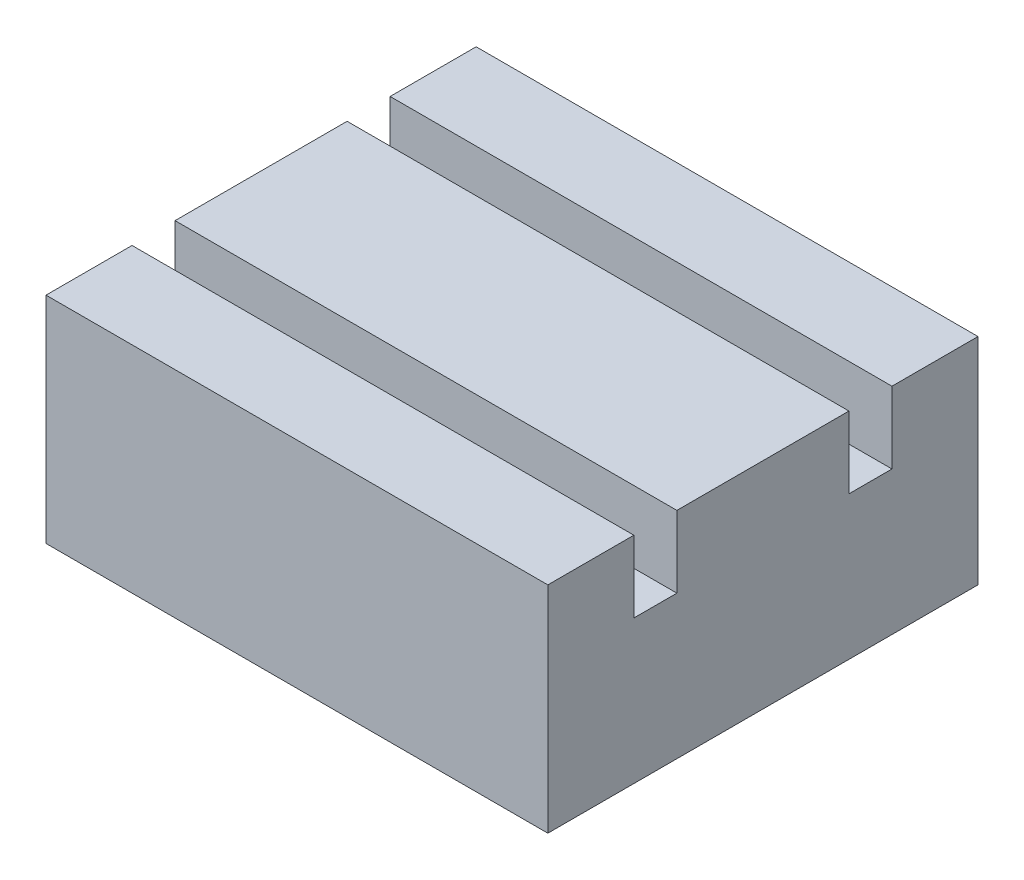
ISO-10303-21;
HEADER;
FILE_DESCRIPTION(('STEP AP214'),'2;1');
FILE_NAME('part.step','',(''),(''),'','','');
FILE_SCHEMA(('AUTOMOTIVE_DESIGN { 1 0 10303 214 1 1 1 1 }'));
ENDSEC;
DATA;
#1=APPLICATION_CONTEXT('core data for automotive mechanical design processes');
#2=APPLICATION_PROTOCOL_DEFINITION('international standard','automotive_design',2000,#1);
#3=PRODUCT_CONTEXT('',#1,'mechanical');
#4=PRODUCT('Part','Part','',(#3));
#5=PRODUCT_RELATED_PRODUCT_CATEGORY('part','',(#4));
#6=PRODUCT_DEFINITION_FORMATION('','',#4);
#7=PRODUCT_DEFINITION_CONTEXT('part definition',#1,'design');
#8=PRODUCT_DEFINITION('design','',#6,#7);
#9=PRODUCT_DEFINITION_SHAPE('','',#8);
#10=(LENGTH_UNIT() NAMED_UNIT(*) SI_UNIT(.MILLI.,.METRE.));
#11=(NAMED_UNIT(*) PLANE_ANGLE_UNIT() SI_UNIT($,.RADIAN.));
#12=(NAMED_UNIT(*) SI_UNIT($,.STERADIAN.) SOLID_ANGLE_UNIT());
#13=UNCERTAINTY_MEASURE_WITH_UNIT(LENGTH_MEASURE(1.E-05),#10,'distance_accuracy_value','');
#14=(GEOMETRIC_REPRESENTATION_CONTEXT(3) GLOBAL_UNCERTAINTY_ASSIGNED_CONTEXT((#13)) GLOBAL_UNIT_ASSIGNED_CONTEXT((#10,
#11,#12)) REPRESENTATION_CONTEXT('',''));
#15=CARTESIAN_POINT('',(0.,0.,0.));
#16=DIRECTION('',(0.,0.,1.));
#17=DIRECTION('',(1.,0.,0.));
#18=AXIS2_PLACEMENT_3D('',#15,#16,#17);
#19=CARTESIAN_POINT('',(0.,0.,0.));
#20=DIRECTION('',(0.,1.,0.));
#21=DIRECTION('',(0.,0.,1.));
#22=AXIS2_PLACEMENT_3D('',#19,#20,#21);
#23=PLANE('',#22);
#24=DIRECTION('',(0.,0.,-1.));
#25=VECTOR('',#24,1.);
#26=CARTESIAN_POINT('',(35.,0.,30.));
#27=LINE('',#26,#25);
#28=CARTESIAN_POINT('',(35.,0.,12.));
#29=VERTEX_POINT('',#28);
#30=CARTESIAN_POINT('',(35.,0.,-12.));
#31=VERTEX_POINT('',#30);
#32=EDGE_CURVE('E227',#29,#31,#27,.T.);
#33=ORIENTED_EDGE('',*,*,#32,.T.);
#34=DIRECTION('',(-1.,0.,0.));
#35=VECTOR('',#34,1.);
#36=CARTESIAN_POINT('',(0.,0.,-12.));
#37=LINE('',#36,#35);
#38=CARTESIAN_POINT('',(-35.,0.,-12.));
#39=VERTEX_POINT('',#38);
#40=EDGE_CURVE('E166',#31,#39,#37,.T.);
#41=ORIENTED_EDGE('',*,*,#40,.T.);
#42=DIRECTION('',(0.,0.,1.));
#43=VECTOR('',#42,1.);
#44=CARTESIAN_POINT('',(-35.,0.,30.));
#45=LINE('',#44,#43);
#46=CARTESIAN_POINT('',(-35.,0.,12.));
#47=VERTEX_POINT('',#46);
#48=EDGE_CURVE('E149',#39,#47,#45,.T.);
#49=ORIENTED_EDGE('',*,*,#48,.T.);
#50=DIRECTION('',(-1.,0.,0.));
#51=VECTOR('',#50,1.);
#52=CARTESIAN_POINT('',(0.,0.,12.));
#53=LINE('',#52,#51);
#54=EDGE_CURVE('E48',#29,#47,#53,.T.);
#55=ORIENTED_EDGE('',*,*,#54,.F.);
#56=EDGE_LOOP('',(#33,#41,#49,#55));
#57=FACE_BOUND('',#56,.T.);
#58=ADVANCED_FACE('F39',(#57),#23,.T.);
#59=CARTESIAN_POINT('',(-35.,0.,-30.));
#60=VERTEX_POINT('',#59);
#61=CARTESIAN_POINT('',(-35.,0.,-18.));
#62=VERTEX_POINT('',#61);
#63=EDGE_CURVE('E214',#60,#62,#45,.T.);
#64=ORIENTED_EDGE('',*,*,#63,.T.);
#65=DIRECTION('',(1.,0.,0.));
#66=VECTOR('',#65,1.);
#67=CARTESIAN_POINT('',(0.,0.,-18.));
#68=LINE('',#67,#66);
#69=CARTESIAN_POINT('',(35.,0.,-18.));
#70=VERTEX_POINT('',#69);
#71=EDGE_CURVE('E161',#62,#70,#68,.T.);
#72=ORIENTED_EDGE('',*,*,#71,.T.);
#73=CARTESIAN_POINT('',(35.,0.,-30.));
#74=VERTEX_POINT('',#73);
#75=EDGE_CURVE('E222',#70,#74,#27,.T.);
#76=ORIENTED_EDGE('',*,*,#75,.T.);
#77=DIRECTION('',(-1.,0.,0.));
#78=VECTOR('',#77,1.);
#79=CARTESIAN_POINT('',(35.,0.,-30.));
#80=LINE('',#79,#78);
#81=EDGE_CURVE('E201',#74,#60,#80,.T.);
#82=ORIENTED_EDGE('',*,*,#81,.T.);
#83=EDGE_LOOP('',(#64,#72,#76,#82));
#84=FACE_BOUND('',#83,.T.);
#85=ADVANCED_FACE('F268',(#84),#23,.T.);
#86=CARTESIAN_POINT('',(-35.,-30.,30.));
#87=DIRECTION('',(-1.,0.,0.));
#88=DIRECTION('',(0.,0.,1.));
#89=AXIS2_PLACEMENT_3D('',#86,#87,#88);
#90=PLANE('',#89);
#91=ORIENTED_EDGE('',*,*,#48,.F.);
#92=DIRECTION('',(0.,1.,0.));
#93=VECTOR('',#92,1.);
#94=CARTESIAN_POINT('',(-35.,10.,-12.));
#95=LINE('',#94,#93);
#96=CARTESIAN_POINT('',(-35.,-10.,-12.));
#97=VERTEX_POINT('',#96);
#98=EDGE_CURVE('E141',#97,#39,#95,.T.);
#99=ORIENTED_EDGE('',*,*,#98,.F.);
#100=DIRECTION('',(0.,0.,1.));
#101=VECTOR('',#100,1.);
#102=CARTESIAN_POINT('',(-35.,-10.,-18.));
#103=LINE('',#102,#101);
#104=CARTESIAN_POINT('',(-35.,-10.,-18.));
#105=VERTEX_POINT('',#104);
#106=EDGE_CURVE('E130',#105,#97,#103,.T.);
#107=ORIENTED_EDGE('',*,*,#106,.F.);
#108=DIRECTION('',(0.,-1.,0.));
#109=VECTOR('',#108,1.);
#110=CARTESIAN_POINT('',(-35.,10.,-18.));
#111=LINE('',#110,#109);
#112=EDGE_CURVE('E140',#62,#105,#111,.T.);
#113=ORIENTED_EDGE('',*,*,#112,.F.);
#114=ORIENTED_EDGE('',*,*,#63,.F.);
#115=DIRECTION('',(0.,1.,0.));
#116=VECTOR('',#115,1.);
#117=CARTESIAN_POINT('',(-35.,-30.,-30.));
#118=LINE('',#117,#116);
#119=CARTESIAN_POINT('',(-35.,-30.,-30.));
#120=VERTEX_POINT('',#119);
#121=EDGE_CURVE('E231',#120,#60,#118,.T.);
#122=ORIENTED_EDGE('',*,*,#121,.F.);
#123=DIRECTION('',(0.,0.,1.));
#124=VECTOR('',#123,1.);
#125=CARTESIAN_POINT('',(-35.,-30.,30.));
#126=LINE('',#125,#124);
#127=CARTESIAN_POINT('',(-35.,-30.,30.));
#128=VERTEX_POINT('',#127);
#129=EDGE_CURVE('E196',#120,#128,#126,.T.);
#130=ORIENTED_EDGE('',*,*,#129,.T.);
#131=DIRECTION('',(0.,1.,0.));
#132=VECTOR('',#131,1.);
#133=CARTESIAN_POINT('',(-35.,-30.,30.));
#134=LINE('',#133,#132);
#135=CARTESIAN_POINT('',(-35.,0.,30.));
#136=VERTEX_POINT('',#135);
#137=EDGE_CURVE('E213',#128,#136,#134,.T.);
#138=ORIENTED_EDGE('',*,*,#137,.T.);
#139=CARTESIAN_POINT('',(-35.,0.,18.));
#140=VERTEX_POINT('',#139);
#141=EDGE_CURVE('E192',#140,#136,#45,.T.);
#142=ORIENTED_EDGE('',*,*,#141,.F.);
#143=DIRECTION('',(0.,-1.,0.));
#144=VECTOR('',#143,1.);
#145=CARTESIAN_POINT('',(-35.,10.,18.));
#146=LINE('',#145,#144);
#147=CARTESIAN_POINT('',(-35.,-10.,18.));
#148=VERTEX_POINT('',#147);
#149=EDGE_CURVE('E63',#140,#148,#146,.T.);
#150=ORIENTED_EDGE('',*,*,#149,.T.);
#151=DIRECTION('',(0.,0.,-1.));
#152=VECTOR('',#151,1.);
#153=CARTESIAN_POINT('',(-35.,-10.,18.));
#154=LINE('',#153,#152);
#155=CARTESIAN_POINT('',(-35.,-10.,12.));
#156=VERTEX_POINT('',#155);
#157=EDGE_CURVE('E176',#148,#156,#154,.T.);
#158=ORIENTED_EDGE('',*,*,#157,.T.);
#159=DIRECTION('',(0.,1.,0.));
#160=VECTOR('',#159,1.);
#161=CARTESIAN_POINT('',(-35.,10.,12.));
#162=LINE('',#161,#160);
#163=EDGE_CURVE('E170',#156,#47,#162,.T.);
#164=ORIENTED_EDGE('',*,*,#163,.T.);
#165=EDGE_LOOP('',(#91,#99,#107,#113,#114,#122,#130,#138,#142,#150,#158,#164));
#166=FACE_BOUND('',#165,.T.);
#167=ADVANCED_FACE('F41',(#166),#90,.T.);
#168=CARTESIAN_POINT('',(35.,-30.,30.));
#169=DIRECTION('',(1.,0.,0.));
#170=DIRECTION('',(0.,0.,-1.));
#171=AXIS2_PLACEMENT_3D('',#168,#169,#170);
#172=PLANE('',#171);
#173=DIRECTION('',(0.,0.,1.));
#174=VECTOR('',#173,1.);
#175=CARTESIAN_POINT('',(35.,-10.,-18.));
#176=LINE('',#175,#174);
#177=CARTESIAN_POINT('',(35.,-10.,-18.));
#178=VERTEX_POINT('',#177);
#179=CARTESIAN_POINT('',(35.,-10.,-12.));
#180=VERTEX_POINT('',#179);
#181=EDGE_CURVE('E151',#178,#180,#176,.T.);
#182=ORIENTED_EDGE('',*,*,#181,.T.);
#183=DIRECTION('',(0.,1.,0.));
#184=VECTOR('',#183,1.);
#185=CARTESIAN_POINT('',(35.,10.,-12.));
#186=LINE('',#185,#184);
#187=EDGE_CURVE('E55',#180,#31,#186,.T.);
#188=ORIENTED_EDGE('',*,*,#187,.T.);
#189=ORIENTED_EDGE('',*,*,#32,.F.);
#190=DIRECTION('',(0.,1.,0.));
#191=VECTOR('',#190,1.);
#192=CARTESIAN_POINT('',(35.,10.,12.));
#193=LINE('',#192,#191);
#194=CARTESIAN_POINT('',(35.,-10.,12.));
#195=VERTEX_POINT('',#194);
#196=EDGE_CURVE('E169',#195,#29,#193,.T.);
#197=ORIENTED_EDGE('',*,*,#196,.F.);
#198=DIRECTION('',(0.,0.,-1.));
#199=VECTOR('',#198,1.);
#200=CARTESIAN_POINT('',(35.,-10.,18.));
#201=LINE('',#200,#199);
#202=CARTESIAN_POINT('',(35.,-10.,18.));
#203=VERTEX_POINT('',#202);
#204=EDGE_CURVE('E173',#203,#195,#201,.T.);
#205=ORIENTED_EDGE('',*,*,#204,.F.);
#206=DIRECTION('',(0.,-1.,0.));
#207=VECTOR('',#206,1.);
#208=CARTESIAN_POINT('',(35.,10.,18.));
#209=LINE('',#208,#207);
#210=CARTESIAN_POINT('',(35.,0.,18.));
#211=VERTEX_POINT('',#210);
#212=EDGE_CURVE('E183',#211,#203,#209,.T.);
#213=ORIENTED_EDGE('',*,*,#212,.F.);
#214=CARTESIAN_POINT('',(35.,0.,30.));
#215=VERTEX_POINT('',#214);
#216=EDGE_CURVE('E223',#215,#211,#27,.T.);
#217=ORIENTED_EDGE('',*,*,#216,.F.);
#218=DIRECTION('',(0.,1.,0.));
#219=VECTOR('',#218,1.);
#220=CARTESIAN_POINT('',(35.,-30.,30.));
#221=LINE('',#220,#219);
#222=CARTESIAN_POINT('',(35.,-30.,30.));
#223=VERTEX_POINT('',#222);
#224=EDGE_CURVE('E239',#223,#215,#221,.T.);
#225=ORIENTED_EDGE('',*,*,#224,.F.);
#226=DIRECTION('',(0.,0.,-1.));
#227=VECTOR('',#226,1.);
#228=CARTESIAN_POINT('',(35.,-30.,30.));
#229=LINE('',#228,#227);
#230=CARTESIAN_POINT('',(35.,-30.,-30.));
#231=VERTEX_POINT('',#230);
#232=EDGE_CURVE('E205',#223,#231,#229,.T.);
#233=ORIENTED_EDGE('',*,*,#232,.T.);
#234=DIRECTION('',(0.,1.,0.));
#235=VECTOR('',#234,1.);
#236=CARTESIAN_POINT('',(35.,-30.,-30.));
#237=LINE('',#236,#235);
#238=EDGE_CURVE('E235',#231,#74,#237,.T.);
#239=ORIENTED_EDGE('',*,*,#238,.T.);
#240=ORIENTED_EDGE('',*,*,#75,.F.);
#241=DIRECTION('',(0.,-1.,0.));
#242=VECTOR('',#241,1.);
#243=CARTESIAN_POINT('',(35.,-30.,-18.));
#244=LINE('',#243,#242);
#245=EDGE_CURVE('E11',#70,#178,#244,.T.);
#246=ORIENTED_EDGE('',*,*,#245,.T.);
#247=EDGE_LOOP('',(#182,#188,#189,#197,#205,#213,#217,#225,#233,#239,#240,#246));
#248=FACE_BOUND('',#247,.T.);
#249=ADVANCED_FACE('F263',(#248),#172,.T.);
#250=CARTESIAN_POINT('',(35.,-30.,-30.));
#251=DIRECTION('',(0.,0.,-1.));
#252=DIRECTION('',(-1.,0.,0.));
#253=AXIS2_PLACEMENT_3D('',#250,#251,#252);
#254=PLANE('',#253);
#255=ORIENTED_EDGE('',*,*,#81,.F.);
#256=ORIENTED_EDGE('',*,*,#238,.F.);
#257=DIRECTION('',(-1.,0.,0.));
#258=VECTOR('',#257,1.);
#259=CARTESIAN_POINT('',(35.,-30.,-30.));
#260=LINE('',#259,#258);
#261=EDGE_CURVE('E209',#231,#120,#260,.T.);
#262=ORIENTED_EDGE('',*,*,#261,.T.);
#263=ORIENTED_EDGE('',*,*,#121,.T.);
#264=EDGE_LOOP('',(#255,#256,#262,#263));
#265=FACE_BOUND('',#264,.T.);
#266=ADVANCED_FACE('F273',(#265),#254,.T.);
#267=CARTESIAN_POINT('',(35.,-30.,30.));
#268=DIRECTION('',(0.,0.,1.));
#269=DIRECTION('',(1.,0.,0.));
#270=AXIS2_PLACEMENT_3D('',#267,#268,#269);
#271=PLANE('',#270);
#272=DIRECTION('',(1.,0.,0.));
#273=VECTOR('',#272,1.);
#274=CARTESIAN_POINT('',(35.,0.,30.));
#275=LINE('',#274,#273);
#276=EDGE_CURVE('E218',#136,#215,#275,.T.);
#277=ORIENTED_EDGE('',*,*,#276,.F.);
#278=ORIENTED_EDGE('',*,*,#137,.F.);
#279=DIRECTION('',(1.,0.,0.));
#280=VECTOR('',#279,1.);
#281=CARTESIAN_POINT('',(35.,-30.,30.));
#282=LINE('',#281,#280);
#283=EDGE_CURVE('E200',#128,#223,#282,.T.);
#284=ORIENTED_EDGE('',*,*,#283,.T.);
#285=ORIENTED_EDGE('',*,*,#224,.T.);
#286=EDGE_LOOP('',(#277,#278,#284,#285));
#287=FACE_BOUND('',#286,.T.);
#288=ADVANCED_FACE('F303',(#287),#271,.T.);
#289=CARTESIAN_POINT('',(0.,-30.,0.));
#290=DIRECTION('',(0.,1.,0.));
#291=DIRECTION('',(0.,0.,1.));
#292=AXIS2_PLACEMENT_3D('',#289,#290,#291);
#293=PLANE('',#292);
#294=ORIENTED_EDGE('',*,*,#129,.F.);
#295=ORIENTED_EDGE('',*,*,#261,.F.);
#296=ORIENTED_EDGE('',*,*,#232,.F.);
#297=ORIENTED_EDGE('',*,*,#283,.F.);
#298=EDGE_LOOP('',(#294,#295,#296,#297));
#299=FACE_BOUND('',#298,.T.);
#300=ADVANCED_FACE('F296',(#299),#293,.F.);
#301=DIRECTION('',(1.,0.,0.));
#302=VECTOR('',#301,1.);
#303=CARTESIAN_POINT('',(0.,0.,18.));
#304=LINE('',#303,#302);
#305=EDGE_CURVE('E234',#140,#211,#304,.T.);
#306=ORIENTED_EDGE('',*,*,#305,.F.);
#307=ORIENTED_EDGE('',*,*,#141,.T.);
#308=ORIENTED_EDGE('',*,*,#276,.T.);
#309=ORIENTED_EDGE('',*,*,#216,.T.);
#310=EDGE_LOOP('',(#306,#307,#308,#309));
#311=FACE_BOUND('',#310,.T.);
#312=ADVANCED_FACE('F289',(#311),#23,.T.);
#313=CARTESIAN_POINT('',(-35.,10.,12.));
#314=DIRECTION('',(0.,0.,-1.));
#315=DIRECTION('',(-1.,0.,0.));
#316=AXIS2_PLACEMENT_3D('',#313,#314,#315);
#317=PLANE('',#316);
#318=ORIENTED_EDGE('',*,*,#54,.T.);
#319=ORIENTED_EDGE('',*,*,#163,.F.);
#320=DIRECTION('',(1.,0.,0.));
#321=VECTOR('',#320,1.);
#322=CARTESIAN_POINT('',(-35.,-10.,12.));
#323=LINE('',#322,#321);
#324=EDGE_CURVE('E189',#156,#195,#323,.T.);
#325=ORIENTED_EDGE('',*,*,#324,.T.);
#326=ORIENTED_EDGE('',*,*,#196,.T.);
#327=EDGE_LOOP('',(#318,#319,#325,#326));
#328=FACE_BOUND('',#327,.T.);
#329=ADVANCED_FACE('F251',(#328),#317,.F.);
#330=CARTESIAN_POINT('',(-35.,-10.,18.));
#331=DIRECTION('',(0.,-1.,0.));
#332=DIRECTION('',(0.,0.,-1.));
#333=AXIS2_PLACEMENT_3D('',#330,#331,#332);
#334=PLANE('',#333);
#335=ORIENTED_EDGE('',*,*,#204,.T.);
#336=ORIENTED_EDGE('',*,*,#324,.F.);
#337=ORIENTED_EDGE('',*,*,#157,.F.);
#338=DIRECTION('',(1.,0.,0.));
#339=VECTOR('',#338,1.);
#340=CARTESIAN_POINT('',(-35.,-10.,18.));
#341=LINE('',#340,#339);
#342=EDGE_CURVE('E180',#148,#203,#341,.T.);
#343=ORIENTED_EDGE('',*,*,#342,.T.);
#344=EDGE_LOOP('',(#335,#336,#337,#343));
#345=FACE_BOUND('',#344,.T.);
#346=ADVANCED_FACE('F259',(#345),#334,.F.);
#347=CARTESIAN_POINT('',(-35.,10.,18.));
#348=DIRECTION('',(0.,0.,1.));
#349=DIRECTION('',(1.,0.,0.));
#350=AXIS2_PLACEMENT_3D('',#347,#348,#349);
#351=PLANE('',#350);
#352=ORIENTED_EDGE('',*,*,#305,.T.);
#353=ORIENTED_EDGE('',*,*,#212,.T.);
#354=ORIENTED_EDGE('',*,*,#342,.F.);
#355=ORIENTED_EDGE('',*,*,#149,.F.);
#356=EDGE_LOOP('',(#352,#353,#354,#355));
#357=FACE_BOUND('',#356,.T.);
#358=ADVANCED_FACE('F285',(#357),#351,.F.);
#359=CARTESIAN_POINT('',(-35.,10.,-12.));
#360=DIRECTION('',(0.,0.,-1.));
#361=DIRECTION('',(-1.,0.,0.));
#362=AXIS2_PLACEMENT_3D('',#359,#360,#361);
#363=PLANE('',#362);
#364=ORIENTED_EDGE('',*,*,#187,.F.);
#365=DIRECTION('',(1.,0.,0.));
#366=VECTOR('',#365,1.);
#367=CARTESIAN_POINT('',(-35.,-10.,-12.));
#368=LINE('',#367,#366);
#369=EDGE_CURVE('E133',#97,#180,#368,.T.);
#370=ORIENTED_EDGE('',*,*,#369,.F.);
#371=ORIENTED_EDGE('',*,*,#98,.T.);
#372=ORIENTED_EDGE('',*,*,#40,.F.);
#373=EDGE_LOOP('',(#364,#370,#371,#372));
#374=FACE_BOUND('',#373,.T.);
#375=ADVANCED_FACE('F143',(#374),#363,.T.);
#376=CARTESIAN_POINT('',(-35.,10.,-18.));
#377=DIRECTION('',(0.,0.,1.));
#378=DIRECTION('',(1.,0.,0.));
#379=AXIS2_PLACEMENT_3D('',#376,#377,#378);
#380=PLANE('',#379);
#381=ORIENTED_EDGE('',*,*,#112,.T.);
#382=DIRECTION('',(1.,0.,0.));
#383=VECTOR('',#382,1.);
#384=CARTESIAN_POINT('',(-35.,-10.,-18.));
#385=LINE('',#384,#383);
#386=EDGE_CURVE('E135',#105,#178,#385,.T.);
#387=ORIENTED_EDGE('',*,*,#386,.T.);
#388=ORIENTED_EDGE('',*,*,#245,.F.);
#389=ORIENTED_EDGE('',*,*,#71,.F.);
#390=EDGE_LOOP('',(#381,#387,#388,#389));
#391=FACE_BOUND('',#390,.T.);
#392=ADVANCED_FACE('F277',(#391),#380,.T.);
#393=CARTESIAN_POINT('',(-35.,-10.,-18.));
#394=DIRECTION('',(0.,1.,0.));
#395=DIRECTION('',(0.,0.,1.));
#396=AXIS2_PLACEMENT_3D('',#393,#394,#395);
#397=PLANE('',#396);
#398=ORIENTED_EDGE('',*,*,#181,.F.);
#399=ORIENTED_EDGE('',*,*,#386,.F.);
#400=ORIENTED_EDGE('',*,*,#106,.T.);
#401=ORIENTED_EDGE('',*,*,#369,.T.);
#402=EDGE_LOOP('',(#398,#399,#400,#401));
#403=FACE_BOUND('',#402,.T.);
#404=ADVANCED_FACE('F132',(#403),#397,.T.);
#405=CLOSED_SHELL('',(#58,#85,#167,#249,#266,#288,#300,#312,#329,#346,#358,#375,#392,#404));
#406=MANIFOLD_SOLID_BREP('B2',#405);
#407=ADVANCED_BREP_SHAPE_REPRESENTATION('',(#18,#406),#14);
#408=SHAPE_DEFINITION_REPRESENTATION(#9,#407);
ENDSEC;
END-ISO-10303-21;
